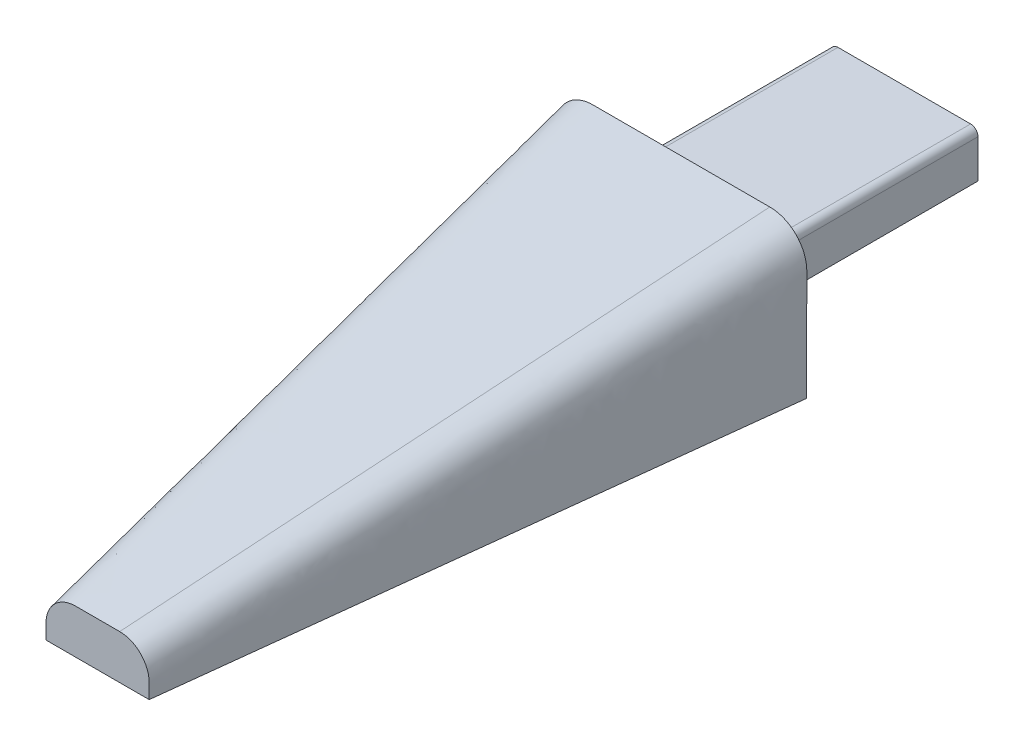
ISO-10303-21;
HEADER;
FILE_DESCRIPTION(('STEP AP214'),'2;1');
FILE_NAME('part.step','',(''),(''),'','','');
FILE_SCHEMA(('AUTOMOTIVE_DESIGN { 1 0 10303 214 1 1 1 1 }'));
ENDSEC;
DATA;
#1=APPLICATION_CONTEXT('core data for automotive mechanical design processes');
#2=APPLICATION_PROTOCOL_DEFINITION('international standard','automotive_design',2000,#1);
#3=PRODUCT_CONTEXT('',#1,'mechanical');
#4=PRODUCT('Part','Part','',(#3));
#5=PRODUCT_RELATED_PRODUCT_CATEGORY('part','',(#4));
#6=PRODUCT_DEFINITION_FORMATION('','',#4);
#7=PRODUCT_DEFINITION_CONTEXT('part definition',#1,'design');
#8=PRODUCT_DEFINITION('design','',#6,#7);
#9=PRODUCT_DEFINITION_SHAPE('','',#8);
#10=(LENGTH_UNIT() NAMED_UNIT(*) SI_UNIT(.MILLI.,.METRE.));
#11=(NAMED_UNIT(*) PLANE_ANGLE_UNIT() SI_UNIT($,.RADIAN.));
#12=(NAMED_UNIT(*) SI_UNIT($,.STERADIAN.) SOLID_ANGLE_UNIT());
#13=UNCERTAINTY_MEASURE_WITH_UNIT(LENGTH_MEASURE(1.E-05),#10,'distance_accuracy_value','');
#14=(GEOMETRIC_REPRESENTATION_CONTEXT(3) GLOBAL_UNCERTAINTY_ASSIGNED_CONTEXT((#13)) GLOBAL_UNIT_ASSIGNED_CONTEXT((#10,
#11,#12)) REPRESENTATION_CONTEXT('',''));
#15=CARTESIAN_POINT('',(0.,0.,0.));
#16=DIRECTION('',(0.,0.,1.));
#17=DIRECTION('',(1.,0.,0.));
#18=AXIS2_PLACEMENT_3D('',#15,#16,#17);
#19=CARTESIAN_POINT('',(0.,-1.55291064728254,15.14));
#20=DIRECTION('',(0.,-1.,0.));
#21=DIRECTION('',(1.,0.,0.));
#22=AXIS2_PLACEMENT_3D('',#19,#20,#21);
#23=PLANE('',#22);
#24=DIRECTION('',(-1.,0.,0.));
#25=VECTOR('',#24,1.);
#26=CARTESIAN_POINT('',(0.,-1.55291064728254,0.));
#27=LINE('',#26,#25);
#28=CARTESIAN_POINT('',(4.99170642576505,-1.55291064728254,0.));
#29=VERTEX_POINT('',#28);
#30=CARTESIAN_POINT('',(-5.00829357423496,-1.55291064728254,0.));
#31=VERTEX_POINT('',#30);
#32=EDGE_CURVE('E466',#29,#31,#27,.T.);
#33=ORIENTED_EDGE('',*,*,#32,.F.);
#34=DIRECTION('',(0.,0.,-1.));
#35=VECTOR('',#34,1.);
#36=CARTESIAN_POINT('',(4.99170642576505,-1.55291064728254,15.14));
#37=LINE('',#36,#35);
#38=CARTESIAN_POINT('',(4.99170642576505,-1.55291064728254,15.14));
#39=VERTEX_POINT('',#38);
#40=EDGE_CURVE('E476',#39,#29,#37,.T.);
#41=ORIENTED_EDGE('',*,*,#40,.F.);
#42=DIRECTION('',(-1.,0.,0.));
#43=VECTOR('',#42,1.);
#44=CARTESIAN_POINT('',(0.,-1.55291064728254,15.14));
#45=LINE('',#44,#43);
#46=CARTESIAN_POINT('',(-5.00829357423496,-1.55291064728254,15.14));
#47=VERTEX_POINT('',#46);
#48=EDGE_CURVE('E450',#39,#47,#45,.T.);
#49=ORIENTED_EDGE('',*,*,#48,.T.);
#50=DIRECTION('',(0.,0.,-1.));
#51=VECTOR('',#50,1.);
#52=CARTESIAN_POINT('',(-5.00829357423496,-1.55291064728254,15.14));
#53=LINE('',#52,#51);
#54=EDGE_CURVE('E465',#47,#31,#53,.T.);
#55=ORIENTED_EDGE('',*,*,#54,.T.);
#56=EDGE_LOOP('',(#33,#41,#49,#55));
#57=FACE_BOUND('',#56,.T.);
#58=ADVANCED_FACE('F167',(#57),#23,.T.);
#59=CARTESIAN_POINT('',(4.99170642576505,0.,15.14));
#60=DIRECTION('',(1.,0.,0.));
#61=DIRECTION('',(0.,1.,0.));
#62=AXIS2_PLACEMENT_3D('',#59,#60,#61);
#63=PLANE('',#62);
#64=DIRECTION('',(0.,-1.,0.));
#65=VECTOR('',#64,1.);
#66=CARTESIAN_POINT('',(4.99170642576505,0.,0.));
#67=LINE('',#66,#65);
#68=CARTESIAN_POINT('',(4.99170642576505,1.05286479627533,0.));
#69=VERTEX_POINT('',#68);
#70=EDGE_CURVE('E469',#69,#29,#67,.T.);
#71=ORIENTED_EDGE('',*,*,#70,.F.);
#72=DIRECTION('',(0.,0.,-1.));
#73=VECTOR('',#72,1.);
#74=CARTESIAN_POINT('',(4.99170642576505,1.05286479627533,15.14));
#75=LINE('',#74,#73);
#76=CARTESIAN_POINT('',(4.99170642576505,1.05286479627533,15.14));
#77=VERTEX_POINT('',#76);
#78=EDGE_CURVE('E182',#69,#77,#75,.F.);
#79=ORIENTED_EDGE('',*,*,#78,.T.);
#80=DIRECTION('',(0.,-1.,0.));
#81=VECTOR('',#80,1.);
#82=CARTESIAN_POINT('',(4.99170642576505,0.,15.14));
#83=LINE('',#82,#81);
#84=EDGE_CURVE('E458',#77,#39,#83,.T.);
#85=ORIENTED_EDGE('',*,*,#84,.T.);
#86=ORIENTED_EDGE('',*,*,#40,.T.);
#87=EDGE_LOOP('',(#71,#79,#85,#86));
#88=FACE_BOUND('',#87,.T.);
#89=ADVANCED_FACE('F514',(#88),#63,.T.);
#90=CARTESIAN_POINT('',(0.,1.55286479627533,15.14));
#91=DIRECTION('',(0.,-1.,0.));
#92=DIRECTION('',(1.,0.,0.));
#93=AXIS2_PLACEMENT_3D('',#90,#91,#92);
#94=PLANE('',#93);
#95=DIRECTION('',(-1.,0.,0.));
#96=VECTOR('',#95,1.);
#97=CARTESIAN_POINT('',(0.,1.55286479627533,0.));
#98=LINE('',#97,#96);
#99=CARTESIAN_POINT('',(4.49170642576505,1.55286479627533,0.));
#100=VERTEX_POINT('',#99);
#101=CARTESIAN_POINT('',(-4.50829357423496,1.55286479627533,0.));
#102=VERTEX_POINT('',#101);
#103=EDGE_CURVE('E471',#100,#102,#98,.T.);
#104=ORIENTED_EDGE('',*,*,#103,.T.);
#105=DIRECTION('',(0.,0.,-1.));
#106=VECTOR('',#105,1.);
#107=CARTESIAN_POINT('',(-4.50829357423496,1.55286479627533,15.14));
#108=LINE('',#107,#106);
#109=CARTESIAN_POINT('',(-4.50829357423496,1.55286479627533,15.14));
#110=VERTEX_POINT('',#109);
#111=EDGE_CURVE('E190',#102,#110,#108,.F.);
#112=ORIENTED_EDGE('',*,*,#111,.T.);
#113=DIRECTION('',(-1.,0.,0.));
#114=VECTOR('',#113,1.);
#115=CARTESIAN_POINT('',(0.,1.55286479627533,15.14));
#116=LINE('',#115,#114);
#117=CARTESIAN_POINT('',(4.49170642576505,1.55286479627533,15.14));
#118=VERTEX_POINT('',#117);
#119=EDGE_CURVE('E461',#118,#110,#116,.T.);
#120=ORIENTED_EDGE('',*,*,#119,.F.);
#121=DIRECTION('',(0.,0.,-1.));
#122=VECTOR('',#121,1.);
#123=CARTESIAN_POINT('',(4.49170642576505,1.55286479627533,0.));
#124=LINE('',#123,#122);
#125=EDGE_CURVE('E493',#118,#100,#124,.T.);
#126=ORIENTED_EDGE('',*,*,#125,.T.);
#127=EDGE_LOOP('',(#104,#112,#120,#126));
#128=FACE_BOUND('',#127,.T.);
#129=ADVANCED_FACE('F510',(#128),#94,.F.);
#130=CARTESIAN_POINT('',(-5.00829357423496,0.,15.14));
#131=DIRECTION('',(1.,0.,0.));
#132=DIRECTION('',(0.,1.,0.));
#133=AXIS2_PLACEMENT_3D('',#130,#131,#132);
#134=PLANE('',#133);
#135=DIRECTION('',(0.,-1.,0.));
#136=VECTOR('',#135,1.);
#137=CARTESIAN_POINT('',(-5.00829357423496,0.,15.14));
#138=LINE('',#137,#136);
#139=CARTESIAN_POINT('',(-5.00829357423496,1.05286479627533,15.14));
#140=VERTEX_POINT('',#139);
#141=EDGE_CURVE('E463',#140,#47,#138,.T.);
#142=ORIENTED_EDGE('',*,*,#141,.F.);
#143=DIRECTION('',(0.,0.,-1.));
#144=VECTOR('',#143,1.);
#145=CARTESIAN_POINT('',(-5.00829357423496,1.05286479627533,15.14));
#146=LINE('',#145,#144);
#147=CARTESIAN_POINT('',(-5.00829357423496,1.05286479627533,0.));
#148=VERTEX_POINT('',#147);
#149=EDGE_CURVE('E478',#140,#148,#146,.T.);
#150=ORIENTED_EDGE('',*,*,#149,.T.);
#151=DIRECTION('',(0.,-1.,0.));
#152=VECTOR('',#151,1.);
#153=CARTESIAN_POINT('',(-5.00829357423496,0.,0.));
#154=LINE('',#153,#152);
#155=EDGE_CURVE('E459',#148,#31,#154,.T.);
#156=ORIENTED_EDGE('',*,*,#155,.T.);
#157=ORIENTED_EDGE('',*,*,#54,.F.);
#158=EDGE_LOOP('',(#142,#150,#156,#157));
#159=FACE_BOUND('',#158,.T.);
#160=ADVANCED_FACE('F505',(#159),#134,.F.);
#161=CARTESIAN_POINT('',(0.,0.,0.));
#162=DIRECTION('',(0.,0.,1.));
#163=DIRECTION('',(1.,0.,0.));
#164=AXIS2_PLACEMENT_3D('',#161,#162,#163);
#165=PLANE('',#164);
#166=ORIENTED_EDGE('',*,*,#155,.F.);
#167=CARTESIAN_POINT('',(-4.50829357423496,1.05286479627533,0.));
#168=DIRECTION('',(0.,0.,1.));
#169=DIRECTION('',(1.,0.,0.));
#170=AXIS2_PLACEMENT_3D('',#167,#168,#169);
#171=CIRCLE('',#170,0.5);
#172=EDGE_CURVE('E491',#148,#102,#171,.F.);
#173=ORIENTED_EDGE('',*,*,#172,.T.);
#174=ORIENTED_EDGE('',*,*,#103,.F.);
#175=CARTESIAN_POINT('',(4.49170642576505,1.05286479627533,0.));
#176=DIRECTION('',(0.,0.,1.));
#177=DIRECTION('',(1.,0.,0.));
#178=AXIS2_PLACEMENT_3D('',#175,#176,#177);
#179=CIRCLE('',#178,0.5);
#180=EDGE_CURVE('E489',#100,#69,#179,.F.);
#181=ORIENTED_EDGE('',*,*,#180,.T.);
#182=ORIENTED_EDGE('',*,*,#70,.T.);
#183=ORIENTED_EDGE('',*,*,#32,.T.);
#184=EDGE_LOOP('',(#166,#173,#174,#181,#182,#183));
#185=FACE_BOUND('',#184,.T.);
#186=ADVANCED_FACE('F509',(#185),#165,.F.);
#187=CARTESIAN_POINT('',(1.89876342714844,-4.,55.14));
#188=DIRECTION('',(0.,0.,1.));
#189=DIRECTION('',(1.,0.,0.));
#190=AXIS2_PLACEMENT_3D('',#187,#188,#189);
#191=PLANE('',#190);
#192=CARTESIAN_POINT('',(1.89876342714844,-4.,55.14));
#193=DIRECTION('',(0.,0.,1.));
#194=DIRECTION('',(1.,0.,0.));
#195=AXIS2_PLACEMENT_3D('',#192,#193,#194);
#196=CIRCLE('',#195,2.);
#197=CARTESIAN_POINT('',(3.89876342714844,-4.,55.14));
#198=VERTEX_POINT('',#197);
#199=CARTESIAN_POINT('',(1.89876342714844,-2.,55.14));
#200=VERTEX_POINT('',#199);
#201=EDGE_CURVE('E288',#198,#200,#196,.T.);
#202=ORIENTED_EDGE('',*,*,#201,.T.);
#203=DIRECTION('',(-1.,0.,0.));
#204=VECTOR('',#203,1.);
#205=CARTESIAN_POINT('',(-1.10123657285156,-2.,55.14));
#206=LINE('',#205,#204);
#207=CARTESIAN_POINT('',(-0.951236572851557,-2.,55.14));
#208=VERTEX_POINT('',#207);
#209=EDGE_CURVE('E354',#200,#208,#206,.T.);
#210=ORIENTED_EDGE('',*,*,#209,.T.);
#211=CARTESIAN_POINT('',(-1.10123657286356,-2.,55.14));
#212=VERTEX_POINT('',#211);
#213=EDGE_CURVE('E291',#208,#212,#206,.T.);
#214=ORIENTED_EDGE('',*,*,#213,.T.);
#215=CARTESIAN_POINT('',(-1.10123657285156,-4.,55.14));
#216=DIRECTION('',(0.,0.,1.));
#217=DIRECTION('',(1.,0.,0.));
#218=AXIS2_PLACEMENT_3D('',#215,#216,#217);
#219=CIRCLE('',#218,2.);
#220=CARTESIAN_POINT('',(-3.10123657285156,-3.99999999999997,55.14));
#221=VERTEX_POINT('',#220);
#222=EDGE_CURVE('E432',#212,#221,#219,.T.);
#223=ORIENTED_EDGE('',*,*,#222,.T.);
#224=DIRECTION('',(0.,-1.,0.));
#225=VECTOR('',#224,1.);
#226=CARTESIAN_POINT('',(-3.10123657285156,-5.,55.14));
#227=LINE('',#226,#225);
#228=CARTESIAN_POINT('',(-3.10123657285156,-5.,55.14));
#229=VERTEX_POINT('',#228);
#230=EDGE_CURVE('E401',#221,#229,#227,.T.);
#231=ORIENTED_EDGE('',*,*,#230,.T.);
#232=DIRECTION('',(1.,0.,0.));
#233=VECTOR('',#232,1.);
#234=CARTESIAN_POINT('',(-3.10123657285156,-5.,55.14));
#235=LINE('',#234,#233);
#236=CARTESIAN_POINT('',(3.89876342714844,-5.,55.14));
#237=VERTEX_POINT('',#236);
#238=EDGE_CURVE('E412',#229,#237,#235,.T.);
#239=ORIENTED_EDGE('',*,*,#238,.T.);
#240=DIRECTION('',(0.,1.,0.));
#241=VECTOR('',#240,1.);
#242=CARTESIAN_POINT('',(3.89876342714844,-5.,55.14));
#243=LINE('',#242,#241);
#244=EDGE_CURVE('E285',#237,#198,#243,.T.);
#245=ORIENTED_EDGE('',*,*,#244,.T.);
#246=EDGE_LOOP('',(#202,#210,#214,#223,#231,#239,#245));
#247=FACE_BOUND('',#246,.T.);
#248=ADVANCED_FACE('F324',(#247),#191,.T.);
#249=CARTESIAN_POINT('',(6.01750920599608,2.50004585100721,15.14));
#250=DIRECTION('',(0.,0.,1.));
#251=DIRECTION('',(1.,0.,0.));
#252=AXIS2_PLACEMENT_3D('',#249,#250,#251);
#253=PLANE('',#252);
#254=ORIENTED_EDGE('',*,*,#48,.F.);
#255=ORIENTED_EDGE('',*,*,#84,.F.);
#256=CARTESIAN_POINT('',(4.49170642576505,1.05286479627533,15.14));
#257=DIRECTION('',(0.,0.,1.));
#258=DIRECTION('',(1.,0.,0.));
#259=AXIS2_PLACEMENT_3D('',#256,#257,#258);
#260=CIRCLE('',#259,0.5);
#261=EDGE_CURVE('E12',#77,#118,#260,.T.);
#262=ORIENTED_EDGE('',*,*,#261,.T.);
#263=ORIENTED_EDGE('',*,*,#119,.T.);
#264=CARTESIAN_POINT('',(-4.50829357423496,1.05286479627533,15.14));
#265=DIRECTION('',(0.,0.,1.));
#266=DIRECTION('',(1.,0.,0.));
#267=AXIS2_PLACEMENT_3D('',#264,#265,#266);
#268=CIRCLE('',#267,0.5);
#269=EDGE_CURVE('E175',#110,#140,#268,.T.);
#270=ORIENTED_EDGE('',*,*,#269,.T.);
#271=ORIENTED_EDGE('',*,*,#141,.T.);
#272=EDGE_LOOP('',(#254,#255,#262,#263,#270,#271));
#273=FACE_BOUND('',#272,.T.);
#274=CARTESIAN_POINT('',(8.51750238808301,2.49420722798189,15.14));
#275=CARTESIAN_POINT('',(8.51755033077943,2.51482517287898,15.14));
#276=CARTESIAN_POINT('',(8.51736411365708,2.53544348260864,15.14));
#277=CARTESIAN_POINT('',(8.51649191779812,2.57667048198126,15.14));
#278=CARTESIAN_POINT('',(8.51580591287071,2.59727917106342,15.14));
#279=CARTESIAN_POINT('',(8.5129516846652,2.65905884827118,15.14));
#280=CARTESIAN_POINT('',(8.50998731881923,2.70019666477534,15.14));
#281=CARTESIAN_POINT('',(8.50192370689111,2.78221948146758,15.14));
#282=CARTESIAN_POINT('',(8.49682640395363,2.8231046774817,15.14));
#283=CARTESIAN_POINT('',(8.48476983024508,2.90460413366076,15.14));
#284=CARTESIAN_POINT('',(8.47781033713432,2.945218360879,15.14));
#285=CARTESIAN_POINT('',(8.46189732422554,3.02597092982307,15.14));
#286=CARTESIAN_POINT('',(8.45294787848111,3.06611006984477,15.14));
#287=CARTESIAN_POINT('',(8.43306470779475,3.14588559303911,15.14));
#288=CARTESIAN_POINT('',(8.42213136294751,3.18552207096301,15.14));
#289=CARTESIAN_POINT('',(8.39827571412756,3.26417990928198,15.14));
#290=CARTESIAN_POINT('',(8.38535397544759,3.3032014410388,15.14));
#291=CARTESIAN_POINT('',(8.35762691814367,3.38058147323794,15.14));
#292=CARTESIAN_POINT('',(8.34282093086165,3.41893973279103,15.14));
#293=CARTESIAN_POINT('',(8.30017983763573,3.52186496044769,15.14));
#294=CARTESIAN_POINT('',(8.27055827647677,3.58570187208836,15.14));
#295=CARTESIAN_POINT('',(8.20602852760487,3.71063780316435,15.14));
#296=CARTESIAN_POINT('',(8.17112117446475,3.77173725284704,15.14));
#297=CARTESIAN_POINT('',(8.11494861270098,3.86095345916281,15.14));
#298=CARTESIAN_POINT('',(8.09559025745828,3.89028526216651,15.14));
#299=CARTESIAN_POINT('',(8.05567802220851,3.94811445924188,15.14));
#300=CARTESIAN_POINT('',(8.03512438694029,3.97661202234386,15.14));
#301=CARTESIAN_POINT('',(7.97169994191081,4.06078383986403,15.14));
#302=CARTESIAN_POINT('',(7.92706221227196,4.11514258746534,15.14));
#303=CARTESIAN_POINT('',(7.83332562478989,4.21989934885382,15.14));
#304=CARTESIAN_POINT('',(7.78422528980143,4.27029604081012,15.14));
#305=CARTESIAN_POINT('',(7.68196332541659,4.36674401722111,15.14));
#306=CARTESIAN_POINT('',(7.62880168045692,4.41279528502228,15.14));
#307=CARTESIAN_POINT('',(7.46374242136635,4.54406560479893,15.14));
#308=CARTESIAN_POINT('',(7.34621810985441,4.62245944742528,15.14));
#309=CARTESIAN_POINT('',(7.1615051514552,4.72409070274155,15.14));
#310=CARTESIAN_POINT('',(7.09853865496869,4.75530478931408,15.14));
#311=CARTESIAN_POINT('',(6.97020629245469,4.81240379298765,15.14));
#312=CARTESIAN_POINT('',(6.90484031348035,4.83828845884579,15.14));
#313=CARTESIAN_POINT('',(6.77222579767926,4.88447181917362,15.14));
#314=CARTESIAN_POINT('',(6.70497881550709,4.90477498475294,15.14));
#315=CARTESIAN_POINT('',(6.56899224984068,4.93949605974068,15.14));
#316=CARTESIAN_POINT('',(6.50025306338746,4.95391551493455,15.14));
#317=CARTESIAN_POINT('',(6.39563048479393,4.97144017755294,15.14));
#318=CARTESIAN_POINT('',(6.36008009573507,4.97663308851079,15.14));
#319=CARTESIAN_POINT('',(6.28880259752819,4.985559050091,15.14));
#320=CARTESIAN_POINT('',(6.25307554517486,4.98929254246151,15.14));
#321=CARTESIAN_POINT('',(6.18155169374209,4.99508990917552,15.14));
#322=CARTESIAN_POINT('',(6.14575513822301,4.99715679557004,15.14));
#323=CARTESIAN_POINT('',(6.07409168061635,4.99972774224953,15.14));
#324=CARTESIAN_POINT('',(6.0382247570455,5.00023121123711,15.14));
#325=CARTESIAN_POINT('',(6.00236810518673,5.,15.14));
#326=B_SPLINE_CURVE_WITH_KNOTS('',3,(#274,#275,#276,#277,#278,#279,#280,#281,#282,#283,#284,
#285,#286,#287,#288,#289,#290,#291,#292,#293,#294,#295,#296,#297,#298,#299,#300,#301,#302,#303,
#304,#305,#306,#307,#308,#309,#310,#311,#312,#313,#314,#315,#316,#317,#318,#319,#320,#321,#322,
#323,#324,#325),.UNSPECIFIED.,.F.,.F.,(4,2,2,2,2,2,2,2,2,2,2,2,2,2,2,2,2,2,2,2,2,2,2,2,2,4),(0.,
0.0618518810106118,0.123707003530525,0.247377638479522,0.37093585166976,0.494508823911626,
0.617831095782783,0.741129765272824,0.864393445966565,0.987700991514084,1.19856492609781,
1.40939560205837,1.51480016053594,1.62018321243778,1.83093035233378,2.04174750644963,
2.25256546847459,2.67396908666646,2.88461505805201,3.09527095756997,3.30575761433287,
3.51618893577001,3.62394940996166,3.73167724107164,3.83920993690484,3.94678329754267),.UNSPECIFIED.);
#327=CARTESIAN_POINT('',(8.51750238808301,2.49420722798189,15.14));
#328=VERTEX_POINT('',#327);
#329=CARTESIAN_POINT('',(6.00236810518673,5.,15.14));
#330=VERTEX_POINT('',#329);
#331=EDGE_CURVE('E269',#328,#330,#326,.T.);
#332=ORIENTED_EDGE('',*,*,#331,.F.);
#333=DIRECTION('',(0.0023354492101257,0.999997272834775,0.));
#334=VECTOR('',#333,1.);
#335=CARTESIAN_POINT('',(8.5,-5.,15.14));
#336=LINE('',#335,#334);
#337=CARTESIAN_POINT('',(8.5,-5.,15.14));
#338=VERTEX_POINT('',#337);
#339=EDGE_CURVE('E263',#338,#328,#336,.T.);
#340=ORIENTED_EDGE('',*,*,#339,.F.);
#341=DIRECTION('',(1.,0.,0.));
#342=VECTOR('',#341,1.);
#343=CARTESIAN_POINT('',(-8.5,-5.,15.14));
#344=LINE('',#343,#342);
#345=CARTESIAN_POINT('',(-8.5,-5.,15.14));
#346=VERTEX_POINT('',#345);
#347=EDGE_CURVE('E266',#346,#338,#344,.T.);
#348=ORIENTED_EDGE('',*,*,#347,.F.);
#349=DIRECTION('',(0.,-1.,0.));
#350=VECTOR('',#349,1.);
#351=CARTESIAN_POINT('',(-8.5,-5.,15.14));
#352=LINE('',#351,#350);
#353=CARTESIAN_POINT('',(-8.5,2.5,15.14));
#354=VERTEX_POINT('',#353);
#355=EDGE_CURVE('E281',#354,#346,#352,.T.);
#356=ORIENTED_EDGE('',*,*,#355,.F.);
#357=CARTESIAN_POINT('',(-6.,5.,15.14));
#358=CARTESIAN_POINT('',(-6.04129076794249,5.00000653966642,15.14));
#359=CARTESIAN_POINT('',(-6.0825829770319,4.99900299721835,15.14));
#360=CARTESIAN_POINT('',(-6.16506316996053,4.99495053651924,15.14));
#361=CARTESIAN_POINT('',(-6.20625116227592,4.99190179035173,15.14));
#362=CARTESIAN_POINT('',(-6.28837397945646,4.98373857280809,15.14));
#363=CARTESIAN_POINT('',(-6.32930904698105,4.97862656017564,15.14));
#364=CARTESIAN_POINT('',(-6.41086965976428,4.9663683625603,15.14));
#365=CARTESIAN_POINT('',(-6.45149519625947,4.95922212020234,15.14));
#366=CARTESIAN_POINT('',(-6.57261627108118,4.93486316687627,15.14));
#367=CARTESIAN_POINT('',(-6.65254327614134,4.91471119401489,15.14));
#368=CARTESIAN_POINT('',(-6.80997803304999,4.86658280667728,15.14));
#369=CARTESIAN_POINT('',(-6.88748628780529,4.83860803093132,15.14));
#370=CARTESIAN_POINT('',(-7.02832485953094,4.77980533285565,15.14));
#371=CARTESIAN_POINT('',(-7.09207755154946,4.74998431133092,15.14));
#372=CARTESIAN_POINT('',(-7.21684773423505,4.68502672969585,15.14));
#373=CARTESIAN_POINT('',(-7.27786421223232,4.64988822229685,15.14));
#374=CARTESIAN_POINT('',(-7.39670288892628,4.57463228434439,15.14));
#375=CARTESIAN_POINT('',(-7.45452661460058,4.53451726421046,15.14));
#376=CARTESIAN_POINT('',(-7.5665501602893,4.44955785315057,15.14));
#377=CARTESIAN_POINT('',(-7.62075146741344,4.40471542269614,15.1399999999999));
#378=CARTESIAN_POINT('',(-7.72521657658226,4.31066547527941,15.1399999999999));
#379=CARTESIAN_POINT('',(-7.77548073947777,4.26145835923696,15.14));
#380=CARTESIAN_POINT('',(-7.8716409838035,4.15895063929961,15.14));
#381=CARTESIAN_POINT('',(-7.91753726741669,4.10565022508427,15.14));
#382=CARTESIAN_POINT('',(-8.00471318819555,3.99536439598719,15.14));
#383=CARTESIAN_POINT('',(-8.04599102184402,3.93837755516007,15.14));
#384=CARTESIAN_POINT('',(-8.12354428899881,3.82109345321994,15.14));
#385=CARTESIAN_POINT('',(-8.15981940525078,3.76079598249739,15.14));
#386=CARTESIAN_POINT('',(-8.22728921555237,3.63745068381864,15.14));
#387=CARTESIAN_POINT('',(-8.25848551346261,3.57440373213744,15.14));
#388=CARTESIAN_POINT('',(-8.31536609807669,3.44585810972992,15.14));
#389=CARTESIAN_POINT('',(-8.34105079565282,3.38035962218562,15.14));
#390=CARTESIAN_POINT('',(-8.37525721300359,3.28069406658582,15.14));
#391=CARTESIAN_POINT('',(-8.38593543061383,3.24725120577275,15.14));
#392=CARTESIAN_POINT('',(-8.40590353893992,3.17995157202564,15.14));
#393=CARTESIAN_POINT('',(-8.41519341419167,3.14609479448572,15.14));
#394=CARTESIAN_POINT('',(-8.43237621401411,3.07802508461065,15.14));
#395=CARTESIAN_POINT('',(-8.44026904083747,3.04381212753185,15.14));
#396=CARTESIAN_POINT('',(-8.45459488739233,2.97508590081507,15.14));
#397=CARTESIAN_POINT('',(-8.46102791816205,2.94057263344992,15.14));
#398=CARTESIAN_POINT('',(-8.47783673140936,2.83888615348574,15.14));
#399=CARTESIAN_POINT('',(-8.48626878119342,2.77137305153299,15.14));
#400=CARTESIAN_POINT('',(-8.49458631819294,2.66977703000603,15.14));
#401=CARTESIAN_POINT('',(-8.49663707355163,2.63585708795164,15.14));
#402=CARTESIAN_POINT('',(-8.49934822330597,2.56795862299587,15.14));
#403=CARTESIAN_POINT('',(-8.50000850780229,2.53398009567646,15.14));
#404=CARTESIAN_POINT('',(-8.50000000000001,2.5,15.14));
#405=B_SPLINE_CURVE_WITH_KNOTS('',3,(#357,#358,#359,#360,#361,#362,#363,#364,#365,#366,#367,
#368,#369,#370,#371,#372,#373,#374,#375,#376,#377,#378,#379,#380,#381,#382,#383,#384,#385,#386,
#387,#388,#389,#390,#391,#392,#393,#394,#395,#396,#397,#398,#399,#400,#401,#402,#403,#404),
.UNSPECIFIED.,.F.,.F.,(4,2,2,2,2,2,2,2,2,2,2,2,2,2,2,2,2,2,2,2,2,2,2,4),(0.,0.123861711639564,
0.247713002855986,0.371417137271991,0.495124761086405,0.741978470540049,0.988780507465771,
1.19968328844619,1.41066349076931,1.62154189898929,1.83233319675864,2.04310515222518,
2.25386734660501,2.46471155903833,2.67556913631106,2.88635999630756,3.09713513705209,
3.20242843345307,3.30772290257905,3.41302473593584,3.51832577302859,3.72216512108612,
3.82408603181127,3.92601499780646),.UNSPECIFIED.);
#406=CARTESIAN_POINT('',(-6.,5.,15.14));
#407=VERTEX_POINT('',#406);
#408=EDGE_CURVE('E484',#407,#354,#405,.T.);
#409=ORIENTED_EDGE('',*,*,#408,.F.);
#410=DIRECTION('',(-1.,0.,0.));
#411=VECTOR('',#410,1.);
#412=CARTESIAN_POINT('',(-6.,5.,15.14));
#413=LINE('',#412,#411);
#414=CARTESIAN_POINT('',(-5.39988159474067,5.,15.14));
#415=VERTEX_POINT('',#414);
#416=EDGE_CURVE('E479',#415,#407,#413,.T.);
#417=ORIENTED_EDGE('',*,*,#416,.F.);
#418=EDGE_CURVE('E481',#330,#415,#413,.T.);
#419=ORIENTED_EDGE('',*,*,#418,.F.);
#420=EDGE_LOOP('',(#332,#340,#348,#356,#409,#417,#419));
#421=FACE_BOUND('',#420,.T.);
#422=ADVANCED_FACE('F265',(#273,#421),#253,.F.);
#423=CARTESIAN_POINT('',(6.00236810518673,5.,15.14));
#424=CARTESIAN_POINT('',(1.89876342714844,-2.,55.14));
#425=CARTESIAN_POINT('',(4.97312579822201,5.,15.14));
#426=CARTESIAN_POINT('',(1.68912791049196,-2.,55.14));
#427=CARTESIAN_POINT('',(3.00481992578011,5.,15.14));
#428=CARTESIAN_POINT('',(1.24779123671001,-2.,55.1399999999999));
#429=CARTESIAN_POINT('',(0.185859296834179,5.,15.14));
#430=CARTESIAN_POINT('',(0.527731017843113,-2.,55.1400000000001));
#431=CARTESIAN_POINT('',(-2.58508535012096,5.,15.14));
#432=CARTESIAN_POINT('',(-0.222420427891782,-2.,55.1399999999999));
#433=CARTESIAN_POINT('',(-4.44969411974672,5.,15.14));
#434=CARTESIAN_POINT('',(-0.713736572851557,-2.,55.14));
#435=CARTESIAN_POINT('',(-5.44989146184561,5.,15.14));
#436=CARTESIAN_POINT('',(-0.963736572851557,-2.,55.14));
#437=CARTESIAN_POINT('',(-5.57771544040842,5.,15.14));
#438=CARTESIAN_POINT('',(-0.986728567430708,-2.,55.14));
#439=CARTESIAN_POINT('',(-5.78331856540992,5.,15.14));
#440=CARTESIAN_POINT('',(-1.01907169486341,-2.,55.14));
#441=CARTESIAN_POINT('',(-5.9078491779709,5.,15.14));
#442=CARTESIAN_POINT('',(-1.05476516292327,-2.,55.14));
#443=CARTESIAN_POINT('',(-5.9720931413854,5.,15.14));
#444=CARTESIAN_POINT('',(-1.08094591797864,-2.,55.14));
#445=CARTESIAN_POINT('',(-6.17467612048309,5.,15.14));
#446=CARTESIAN_POINT('',(-1.2282409384883,-2.,55.14));
#447=CARTESIAN_POINT('',(-6.49959758313366,4.96430134800043,15.14));
#448=CARTESIAN_POINT('',(-1.49691866159043,-2.02543531366592,55.14));
#449=CARTESIAN_POINT('',(-6.93489601431824,4.83270727828004,15.14));
#450=CARTESIAN_POINT('',(-1.9117856183329,-2.1528569595442,55.14));
#451=CARTESIAN_POINT('',(-7.32552261000197,4.63442987735971,15.14));
#452=CARTESIAN_POINT('',(-2.30634634376807,-2.38251001518354,55.14));
#453=CARTESIAN_POINT('',(-7.67391143062691,4.37386424217285,15.1399999999999));
#454=CARTESIAN_POINT('',(-2.62960531954943,-2.68644458037466,55.14));
#455=CARTESIAN_POINT('',(-7.9787639970922,4.05032408231543,15.14));
#456=CARTESIAN_POINT('',(-2.86485179748124,-3.02896937151683,55.14));
#457=CARTESIAN_POINT('',(-8.23430691778702,3.65592090771334,15.14));
#458=CARTESIAN_POINT('',(-3.0118475247454,-3.37524340502571,55.14));
#459=CARTESIAN_POINT('',(-8.39672379588464,3.2542401484388,15.14));
#460=CARTESIAN_POINT('',(-3.07511882251402,-3.64816942998401,55.14));
#461=CARTESIAN_POINT('',(-8.48033271737263,2.86262329638971,15.14));
#462=CARTESIAN_POINT('',(-3.0978707001556,-3.8539878753811,55.14));
#463=CARTESIAN_POINT('',(-8.50000000000001,2.6318855267506,15.14));
#464=CARTESIAN_POINT('',(-3.10123657285156,-3.95219947775812,55.14));
#465=CARTESIAN_POINT('',(-8.5,2.07529287568597,15.14));
#466=CARTESIAN_POINT('',(-3.10123657285156,-4.1539306309209,55.14));
#467=CARTESIAN_POINT('',(-8.5,1.12745757949176,15.14));
#468=CARTESIAN_POINT('',(-3.10123657285156,-4.29706256286025,55.1399999999999));
#469=CARTESIAN_POINT('',(-8.50000000000001,-0.819864409317434,15.14));
#470=CARTESIAN_POINT('',(-3.10123657285155,-4.52763040494037,55.1400000000001));
#471=CARTESIAN_POINT('',(-8.49999999999999,-3.19116442543307,15.14));
#472=CARTESIAN_POINT('',(-3.10123657285156,-4.73194748232067,55.1399999999999));
#473=CARTESIAN_POINT('',(-8.5,-4.45405483197078,15.14));
#474=CARTESIAN_POINT('',(-3.10123657285156,-4.88880218332315,55.14));
#475=CARTESIAN_POINT('',(-8.5,-5.,15.14));
#476=CARTESIAN_POINT('',(-3.10123657285156,-5.,55.14));
#477=B_SPLINE_SURFACE_WITH_KNOTS('',3,1,((#423,#424),(#425,#426),(#427,#428),(#429,#430),(#431,
#432),(#433,#434),(#435,#436),(#437,#438),(#439,#440),(#441,#442),(#443,#444),(#445,#446),(#447,
#448),(#449,#450),(#451,#452),(#453,#454),(#455,#456),(#457,#458),(#459,#460),(#461,#462),(#463,
#464),(#465,#466),(#467,#468),(#469,#470),(#471,#472),(#473,#474),(#475,#476)),.UNSPECIFIED.,
.F.,.F.,.F.,(4,1,1,1,2,1,1,1,2,1,1,1,1,1,1,1,1,2,1,1,1,4),(2,2),(0.,0.111510840634718,
0.223021681269435,0.334532521904153,0.44604336253887,0.451912354151224,0.457781345763577,
0.463650337375931,0.469519328988284,0.506254839309307,0.54299034963033,0.579725859951354,
0.616461370272376,0.653196880593399,0.689932390914422,0.726667901235445,0.745035656395957,
0.763403411556468,0.822552558667351,0.881701705778234,0.940850852889117,1.),(0.,1.),.UNSPECIFIED.);
#478=DIRECTION('',(0.133756288014719,0.,0.991014255909835));
#479=VECTOR('',#478,1.);
#480=CARTESIAN_POINT('',(-5.80061828642578,-5.,35.14));
#481=LINE('',#480,#479);
#482=EDGE_CURVE('E280',#346,#229,#481,.T.);
#483=DIRECTION('',(0.100542326194799,0.17150684302759,-0.980039103014797));
#484=VECTOR('',#483,1.);
#485=CARTESIAN_POINT('',(3.95056576616759,1.5,35.14));
#486=LINE('',#485,#484);
#487=EDGE_CURVE('E272',#200,#330,#486,.T.);
#488=ORIENTED_EDGE('',*,*,#418,.T.);
#489=ORIENTED_EDGE('',*,*,#416,.T.);
#490=ORIENTED_EDGE('',*,*,#408,.T.);
#491=ORIENTED_EDGE('',*,*,#355,.T.);
#492=ORIENTED_EDGE('',*,*,#482,.T.);
#493=ORIENTED_EDGE('',*,*,#230,.F.);
#494=ORIENTED_EDGE('',*,*,#222,.F.);
#495=ORIENTED_EDGE('',*,*,#213,.F.);
#496=ORIENTED_EDGE('',*,*,#209,.F.);
#497=ORIENTED_EDGE('',*,*,#487,.T.);
#498=EDGE_LOOP('',(#488,#489,#490,#491,#492,#493,#494,#495,#496,#497));
#499=FACE_BOUND('',#498,.T.);
#500=ADVANCED_FACE('F359',(#499),#477,.T.);
#501=CARTESIAN_POINT('',(-8.5,-5.,15.14));
#502=DIRECTION('',(0.,-1.,0.));
#503=DIRECTION('',(1.,0.,0.));
#504=AXIS2_PLACEMENT_3D('',#501,#502,#503);
#505=PLANE('',#504);
#506=ORIENTED_EDGE('',*,*,#347,.T.);
#507=DIRECTION('',(-0.11427733379721,0.,0.993448886948997));
#508=VECTOR('',#507,1.);
#509=CARTESIAN_POINT('',(6.19938171357422,-5.,35.14));
#510=LINE('',#509,#508);
#511=EDGE_CURVE('E277',#338,#237,#510,.T.);
#512=ORIENTED_EDGE('',*,*,#511,.T.);
#513=ORIENTED_EDGE('',*,*,#238,.F.);
#514=ORIENTED_EDGE('',*,*,#482,.F.);
#515=EDGE_LOOP('',(#506,#512,#513,#514));
#516=FACE_BOUND('',#515,.T.);
#517=ADVANCED_FACE('F276',(#516),#505,.T.);
#518=CARTESIAN_POINT('',(8.5,-5.,15.14));
#519=CARTESIAN_POINT('',(3.89876342714844,-5.,55.14));
#520=CARTESIAN_POINT('',(8.50099199645189,-4.57524499258941,15.14));
#521=CARTESIAN_POINT('',(3.89876342714844,-4.84625620278861,55.14));
#522=CARTESIAN_POINT('',(8.50317657803416,-3.63984651975276,15.14));
#523=CARTESIAN_POINT('',(3.89876342714844,-4.71458287589578,55.14));
#524=CARTESIAN_POINT('',(8.5087511940415,-1.25289638600905,15.14));
#525=CARTESIAN_POINT('',(3.89876342714845,-4.5,55.14));
#526=CARTESIAN_POINT('',(8.51432581004887,1.13405374773464,15.14));
#527=CARTESIAN_POINT('',(3.89876342714844,-4.28541712410421,55.14));
#528=CARTESIAN_POINT('',(8.51651039163112,2.0694522205713,15.14));
#529=CARTESIAN_POINT('',(3.89876342714844,-4.15374379721139,55.14));
#530=CARTESIAN_POINT('',(8.51781111132202,2.62639695650496,15.14));
#531=CARTESIAN_POINT('',(3.89876342714844,-3.95215276933105,55.14));
#532=CARTESIAN_POINT('',(8.49908526970346,2.84694620711261,15.14));
#533=CARTESIAN_POINT('',(3.89539131929357,-3.85291348781,55.14));
#534=CARTESIAN_POINT('',(8.44348924383949,3.12356118162594,15.14));
#535=CARTESIAN_POINT('',(3.87738352589105,-3.69301674431208,55.14));
#536=CARTESIAN_POINT('',(8.36763855407126,3.36372211124822,15.14));
#537=CARTESIAN_POINT('',(3.84359279281272,-3.5216788189309,55.14));
#538=CARTESIAN_POINT('',(8.24586536745933,3.65118142016729,15.14));
#539=CARTESIAN_POINT('',(3.77230029659196,-3.27955025072385,55.14));
#540=CARTESIAN_POINT('',(8.05992626719242,3.96193069120216,15.14));
#541=CARTESIAN_POINT('',(3.62424883006932,-2.95419999130268,55.14));
#542=CARTESIAN_POINT('',(7.79006370427346,4.27920837262663,15.14));
#543=CARTESIAN_POINT('',(3.32741895680836,-2.57137978863776,55.14));
#544=CARTESIAN_POINT('',(7.47178405606507,4.5478884715019,15.14));
#545=CARTESIAN_POINT('',(2.94461695566554,-2.27453908511982,55.14));
#546=CARTESIAN_POINT('',(7.16034505371733,4.73266998105686,15.14));
#547=CARTESIAN_POINT('',(2.61924540807663,-2.12649312144677,55.14));
#548=CARTESIAN_POINT('',(6.87243461473188,4.85337268353306,15.14));
#549=CARTESIAN_POINT('',(2.37711462481815,-2.05518084959428,55.14));
#550=CARTESIAN_POINT('',(6.63199310600725,4.92832920518115,15.14));
#551=CARTESIAN_POINT('',(2.2057722202768,-2.02137645829155,55.14));
#552=CARTESIAN_POINT('',(6.35517317272071,4.98289555701185,15.14));
#553=CARTESIAN_POINT('',(2.04585795413412,-2.0033694426191,55.14));
#554=CARTESIAN_POINT('',(6.13455576979453,5.00080060138558,15.14));
#555=CARTESIAN_POINT('',(1.94661065781739,-2.,55.14));
#556=CARTESIAN_POINT('',(6.00236810518673,5.,15.14));
#557=CARTESIAN_POINT('',(1.89876342714844,-2.,55.14));
#558=B_SPLINE_SURFACE_WITH_KNOTS('',3,1,((#518,#519),(#520,#521),(#522,#523),(#524,#525),(#526,
#527),(#528,#529),(#530,#531),(#532,#533),(#534,#535),(#536,#537),(#538,#539),(#540,#541),(#542,
#543),(#544,#545),(#546,#547),(#548,#549),(#550,#551),(#552,#553),(#554,#555),(#556,#557)),
.UNSPECIFIED.,.F.,.F.,.F.,(4,1,1,1,2,1,1,1,1,1,1,1,1,1,1,1,4),(2,2),(0.,0.111365706435275,
0.22273141287055,0.334097119305824,0.445462825741099,0.48012139913228,0.514779972523462,
0.549438545914643,0.584097119305824,0.653414266088187,0.722731412870549,0.792048559652912,
0.861365706435275,0.896024279826456,0.930682853217637,0.965341426608819,1.),(0.,1.),.UNSPECIFIED.);
#559=ORIENTED_EDGE('',*,*,#339,.T.);
#560=ORIENTED_EDGE('',*,*,#331,.T.);
#561=ORIENTED_EDGE('',*,*,#487,.F.);
#562=ORIENTED_EDGE('',*,*,#201,.F.);
#563=ORIENTED_EDGE('',*,*,#244,.F.);
#564=ORIENTED_EDGE('',*,*,#511,.F.);
#565=EDGE_LOOP('',(#559,#560,#561,#562,#563,#564));
#566=FACE_BOUND('',#565,.T.);
#567=ADVANCED_FACE('F283',(#566),#558,.T.);
#568=CARTESIAN_POINT('',(-4.50829357423496,1.05286479627533,15.14));
#569=DIRECTION('',(0.,0.,-1.));
#570=DIRECTION('',(-1.,0.,0.));
#571=AXIS2_PLACEMENT_3D('',#568,#569,#570);
#572=CYLINDRICAL_SURFACE('',#571,0.5);
#573=ORIENTED_EDGE('',*,*,#269,.F.);
#574=ORIENTED_EDGE('',*,*,#111,.F.);
#575=ORIENTED_EDGE('',*,*,#172,.F.);
#576=ORIENTED_EDGE('',*,*,#149,.F.);
#577=EDGE_LOOP('',(#573,#574,#575,#576));
#578=FACE_BOUND('',#577,.T.);
#579=ADVANCED_FACE('F321',(#578),#572,.T.);
#580=CARTESIAN_POINT('',(4.49170642576505,1.05286479627533,15.14));
#581=DIRECTION('',(0.,0.,1.));
#582=DIRECTION('',(1.,0.,0.));
#583=AXIS2_PLACEMENT_3D('',#580,#581,#582);
#584=CYLINDRICAL_SURFACE('',#583,0.5);
#585=ORIENTED_EDGE('',*,*,#261,.F.);
#586=ORIENTED_EDGE('',*,*,#78,.F.);
#587=ORIENTED_EDGE('',*,*,#180,.F.);
#588=ORIENTED_EDGE('',*,*,#125,.F.);
#589=EDGE_LOOP('',(#585,#586,#587,#588));
#590=FACE_BOUND('',#589,.T.);
#591=ADVANCED_FACE('F169',(#590),#584,.T.);
#592=CLOSED_SHELL('',(#58,#89,#129,#160,#186,#248,#422,#500,#517,#567,#579,#591));
#593=MANIFOLD_SOLID_BREP('B2',#592);
#594=ADVANCED_BREP_SHAPE_REPRESENTATION('',(#18,#593),#14);
#595=SHAPE_DEFINITION_REPRESENTATION(#9,#594);
ENDSEC;
END-ISO-10303-21;
